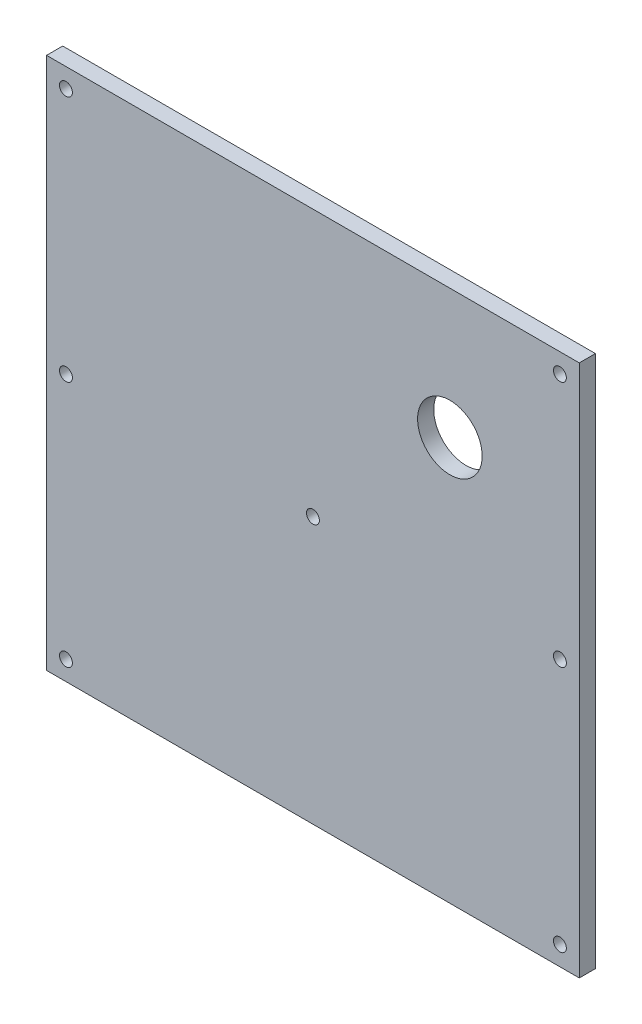
ISO-10303-21;
HEADER;
FILE_DESCRIPTION(('STEP AP214'),'2;1');
FILE_NAME('part.step','',(''),(''),'','','');
FILE_SCHEMA(('AUTOMOTIVE_DESIGN { 1 0 10303 214 1 1 1 1 }'));
ENDSEC;
DATA;
#1=APPLICATION_CONTEXT('core data for automotive mechanical design processes');
#2=APPLICATION_PROTOCOL_DEFINITION('international standard','automotive_design',2000,#1);
#3=PRODUCT_CONTEXT('',#1,'mechanical');
#4=PRODUCT('Part','Part','',(#3));
#5=PRODUCT_RELATED_PRODUCT_CATEGORY('part','',(#4));
#6=PRODUCT_DEFINITION_FORMATION('','',#4);
#7=PRODUCT_DEFINITION_CONTEXT('part definition',#1,'design');
#8=PRODUCT_DEFINITION('design','',#6,#7);
#9=PRODUCT_DEFINITION_SHAPE('','',#8);
#10=(LENGTH_UNIT() NAMED_UNIT(*) SI_UNIT(.MILLI.,.METRE.));
#11=(NAMED_UNIT(*) PLANE_ANGLE_UNIT() SI_UNIT($,.RADIAN.));
#12=(NAMED_UNIT(*) SI_UNIT($,.STERADIAN.) SOLID_ANGLE_UNIT());
#13=UNCERTAINTY_MEASURE_WITH_UNIT(LENGTH_MEASURE(1.E-05),#10,'distance_accuracy_value','');
#14=(GEOMETRIC_REPRESENTATION_CONTEXT(3) GLOBAL_UNCERTAINTY_ASSIGNED_CONTEXT((#13)) GLOBAL_UNIT_ASSIGNED_CONTEXT((#10,
#11,#12)) REPRESENTATION_CONTEXT('',''));
#15=CARTESIAN_POINT('',(0.,0.,0.));
#16=DIRECTION('',(0.,0.,1.));
#17=DIRECTION('',(1.,0.,0.));
#18=AXIS2_PLACEMENT_3D('',#15,#16,#17);
#19=CARTESIAN_POINT('',(0.,0.,0.));
#20=DIRECTION('',(0.,0.,-1.));
#21=DIRECTION('',(-1.,0.,0.));
#22=AXIS2_PLACEMENT_3D('',#19,#20,#21);
#23=PLANE('',#22);
#24=CARTESIAN_POINT('',(42.4168660797203,42.4434253709725,0.));
#25=DIRECTION('',(0.,0.,1.));
#26=DIRECTION('',(1.,0.,0.));
#27=AXIS2_PLACEMENT_3D('',#24,#25,#26);
#28=CIRCLE('',#27,10.);
#29=CARTESIAN_POINT('',(52.4168660797203,42.4434253709725,0.));
#30=VERTEX_POINT('',#29);
#31=EDGE_CURVE('E180',#30,#30,#28,.T.);
#32=ORIENTED_EDGE('',*,*,#31,.T.);
#33=EDGE_LOOP('',(#32));
#34=FACE_BOUND('',#33,.T.);
#35=CARTESIAN_POINT('',(76.5,76.5,0.));
#36=DIRECTION('',(0.,0.,1.));
#37=DIRECTION('',(1.,0.,0.));
#38=AXIS2_PLACEMENT_3D('',#35,#36,#37);
#39=CIRCLE('',#38,2.);
#40=CARTESIAN_POINT('',(78.5,76.5,0.));
#41=VERTEX_POINT('',#40);
#42=EDGE_CURVE('E195',#41,#41,#39,.T.);
#43=ORIENTED_EDGE('',*,*,#42,.T.);
#44=EDGE_LOOP('',(#43));
#45=FACE_BOUND('',#44,.T.);
#46=CARTESIAN_POINT('',(76.5,-76.5,0.));
#47=DIRECTION('',(0.,0.,1.));
#48=DIRECTION('',(1.,0.,0.));
#49=AXIS2_PLACEMENT_3D('',#46,#47,#48);
#50=CIRCLE('',#49,2.);
#51=CARTESIAN_POINT('',(78.5,-76.5,0.));
#52=VERTEX_POINT('',#51);
#53=EDGE_CURVE('E207',#52,#52,#50,.T.);
#54=ORIENTED_EDGE('',*,*,#53,.T.);
#55=EDGE_LOOP('',(#54));
#56=FACE_BOUND('',#55,.T.);
#57=CARTESIAN_POINT('',(-76.5,0.,0.));
#58=DIRECTION('',(0.,0.,1.));
#59=DIRECTION('',(1.,0.,0.));
#60=AXIS2_PLACEMENT_3D('',#57,#58,#59);
#61=CIRCLE('',#60,2.);
#62=CARTESIAN_POINT('',(-74.5,0.,0.));
#63=VERTEX_POINT('',#62);
#64=EDGE_CURVE('E219',#63,#63,#61,.T.);
#65=ORIENTED_EDGE('',*,*,#64,.T.);
#66=EDGE_LOOP('',(#65));
#67=FACE_BOUND('',#66,.T.);
#68=DIRECTION('',(0.,1.,0.));
#69=VECTOR('',#68,1.);
#70=CARTESIAN_POINT('',(82.5,-82.5,0.));
#71=LINE('',#70,#69);
#72=CARTESIAN_POINT('',(82.5,-82.5,0.));
#73=VERTEX_POINT('',#72);
#74=CARTESIAN_POINT('',(82.5,82.5,0.));
#75=VERTEX_POINT('',#74);
#76=EDGE_CURVE('E231',#73,#75,#71,.T.);
#77=ORIENTED_EDGE('',*,*,#76,.F.);
#78=DIRECTION('',(1.,0.,0.));
#79=VECTOR('',#78,1.);
#80=CARTESIAN_POINT('',(-82.5,-82.5,0.));
#81=LINE('',#80,#79);
#82=CARTESIAN_POINT('',(-82.5,-82.5,0.));
#83=VERTEX_POINT('',#82);
#84=EDGE_CURVE('E78',#83,#73,#81,.T.);
#85=ORIENTED_EDGE('',*,*,#84,.F.);
#86=DIRECTION('',(0.,-1.,0.));
#87=VECTOR('',#86,1.);
#88=CARTESIAN_POINT('',(-82.5,-82.5,0.));
#89=LINE('',#88,#87);
#90=CARTESIAN_POINT('',(-82.5,82.5,0.));
#91=VERTEX_POINT('',#90);
#92=EDGE_CURVE('E245',#91,#83,#89,.T.);
#93=ORIENTED_EDGE('',*,*,#92,.F.);
#94=DIRECTION('',(-1.,0.,0.));
#95=VECTOR('',#94,1.);
#96=CARTESIAN_POINT('',(-82.5,82.5,0.));
#97=LINE('',#96,#95);
#98=EDGE_CURVE('E243',#75,#91,#97,.T.);
#99=ORIENTED_EDGE('',*,*,#98,.F.);
#100=EDGE_LOOP('',(#77,#85,#93,#99));
#101=FACE_BOUND('',#100,.T.);
#102=CARTESIAN_POINT('',(-76.5,76.5,0.));
#103=DIRECTION('',(0.,0.,1.));
#104=DIRECTION('',(1.,0.,0.));
#105=AXIS2_PLACEMENT_3D('',#102,#103,#104);
#106=CIRCLE('',#105,2.);
#107=CARTESIAN_POINT('',(-74.5,76.5,0.));
#108=VERTEX_POINT('',#107);
#109=EDGE_CURVE('E225',#108,#108,#106,.T.);
#110=ORIENTED_EDGE('',*,*,#109,.T.);
#111=EDGE_LOOP('',(#110));
#112=FACE_BOUND('',#111,.T.);
#113=CARTESIAN_POINT('',(-76.5,-76.5,0.));
#114=DIRECTION('',(0.,0.,1.));
#115=DIRECTION('',(1.,0.,0.));
#116=AXIS2_PLACEMENT_3D('',#113,#114,#115);
#117=CIRCLE('',#116,2.00000000000004);
#118=CARTESIAN_POINT('',(-74.5,-76.5,0.));
#119=VERTEX_POINT('',#118);
#120=EDGE_CURVE('E213',#119,#119,#117,.T.);
#121=ORIENTED_EDGE('',*,*,#120,.T.);
#122=EDGE_LOOP('',(#121));
#123=FACE_BOUND('',#122,.T.);
#124=CARTESIAN_POINT('',(76.5,0.,0.));
#125=DIRECTION('',(0.,0.,1.));
#126=DIRECTION('',(1.,0.,0.));
#127=AXIS2_PLACEMENT_3D('',#124,#125,#126);
#128=CIRCLE('',#127,2.);
#129=CARTESIAN_POINT('',(78.5,0.,0.));
#130=VERTEX_POINT('',#129);
#131=EDGE_CURVE('E201',#130,#130,#128,.T.);
#132=ORIENTED_EDGE('',*,*,#131,.T.);
#133=EDGE_LOOP('',(#132));
#134=FACE_BOUND('',#133,.T.);
#135=CARTESIAN_POINT('',(0.,0.,0.));
#136=DIRECTION('',(0.,0.,1.));
#137=DIRECTION('',(1.,0.,0.));
#138=AXIS2_PLACEMENT_3D('',#135,#136,#137);
#139=CIRCLE('',#138,2.);
#140=CARTESIAN_POINT('',(2.00000000000001,0.,0.));
#141=VERTEX_POINT('',#140);
#142=EDGE_CURVE('E190',#141,#141,#139,.T.);
#143=ORIENTED_EDGE('',*,*,#142,.T.);
#144=EDGE_LOOP('',(#143));
#145=FACE_BOUND('',#144,.T.);
#146=DIRECTION('',(0.,1.,0.));
#147=VECTOR('',#146,1.);
#148=CARTESIAN_POINT('',(2.00000000000002,12.2284161474005,0.));
#149=LINE('',#148,#147);
#150=CARTESIAN_POINT('',(2.00000000000001,7.2284161474005,0.));
#151=VERTEX_POINT('',#150);
#152=CARTESIAN_POINT('',(2.00000000000002,12.2284161474005,0.));
#153=VERTEX_POINT('',#152);
#154=EDGE_CURVE('E525',#151,#153,#149,.T.);
#155=ORIENTED_EDGE('',*,*,#154,.F.);
#156=CARTESIAN_POINT('',(0.,0.,0.));
#157=DIRECTION('',(0.,0.,1.));
#158=DIRECTION('',(-1.,0.,0.));
#159=AXIS2_PLACEMENT_3D('',#156,#157,#158);
#160=CIRCLE('',#159,7.50000000000001);
#161=CARTESIAN_POINT('',(3.99999999999999,6.3442887702248,0.));
#162=VERTEX_POINT('',#161);
#163=EDGE_CURVE('E178',#162,#151,#160,.T.);
#164=ORIENTED_EDGE('',*,*,#163,.F.);
#165=DIRECTION('',(0.,-1.,0.));
#166=VECTOR('',#165,1.);
#167=CARTESIAN_POINT('',(4.00000000000001,77.1438713867357,0.));
#168=LINE('',#167,#166);
#169=CARTESIAN_POINT('',(4.00000000000001,77.1438713867357,0.));
#170=VERTEX_POINT('',#169);
#171=EDGE_CURVE('E174',#170,#162,#168,.T.);
#172=ORIENTED_EDGE('',*,*,#171,.F.);
#173=DIRECTION('',(1.,0.,0.));
#174=VECTOR('',#173,1.);
#175=CARTESIAN_POINT('',(2.00000000000001,77.1438713867357,0.));
#176=LINE('',#175,#174);
#177=CARTESIAN_POINT('',(2.00000000000001,77.1438713867357,0.));
#178=VERTEX_POINT('',#177);
#179=EDGE_CURVE('E521',#178,#170,#176,.T.);
#180=ORIENTED_EDGE('',*,*,#179,.F.);
#181=DIRECTION('',(0.,1.,0.));
#182=VECTOR('',#181,1.);
#183=CARTESIAN_POINT('',(2.00000000000001,77.1438713867357,0.));
#184=LINE('',#183,#182);
#185=CARTESIAN_POINT('',(2.00000000000001,72.5000000000001,0.));
#186=VERTEX_POINT('',#185);
#187=EDGE_CURVE('E545',#186,#178,#184,.T.);
#188=ORIENTED_EDGE('',*,*,#187,.F.);
#189=DIRECTION('',(1.,0.,0.));
#190=VECTOR('',#189,1.);
#191=CARTESIAN_POINT('',(-2.,72.5,0.));
#192=LINE('',#191,#190);
#193=CARTESIAN_POINT('',(-2.,72.5,0.));
#194=VERTEX_POINT('',#193);
#195=EDGE_CURVE('E543',#194,#186,#192,.T.);
#196=ORIENTED_EDGE('',*,*,#195,.F.);
#197=DIRECTION('',(0.,-1.,0.));
#198=VECTOR('',#197,1.);
#199=CARTESIAN_POINT('',(-1.99999999999998,77.4913592979423,0.));
#200=LINE('',#199,#198);
#201=CARTESIAN_POINT('',(-1.99999999999998,77.4913592979423,0.));
#202=VERTEX_POINT('',#201);
#203=EDGE_CURVE('E541',#202,#194,#200,.T.);
#204=ORIENTED_EDGE('',*,*,#203,.F.);
#205=DIRECTION('',(0.999990667414141,-0.00432031070884864,0.));
#206=VECTOR('',#205,1.);
#207=CARTESIAN_POINT('',(-3.99999999999998,77.5,0.));
#208=LINE('',#207,#206);
#209=CARTESIAN_POINT('',(-3.99999999999998,77.5,0.));
#210=VERTEX_POINT('',#209);
#211=EDGE_CURVE('E539',#210,#202,#208,.T.);
#212=ORIENTED_EDGE('',*,*,#211,.F.);
#213=DIRECTION('',(0.,1.,0.));
#214=VECTOR('',#213,1.);
#215=CARTESIAN_POINT('',(-3.99999999999998,77.5,0.));
#216=LINE('',#215,#214);
#217=CARTESIAN_POINT('',(-4.00000000000001,6.34428877022478,0.));
#218=VERTEX_POINT('',#217);
#219=EDGE_CURVE('E537',#218,#210,#216,.T.);
#220=ORIENTED_EDGE('',*,*,#219,.F.);
#221=CARTESIAN_POINT('',(0.,0.,0.));
#222=DIRECTION('',(0.,0.,1.));
#223=DIRECTION('',(-1.,0.,0.));
#224=AXIS2_PLACEMENT_3D('',#221,#222,#223);
#225=CIRCLE('',#224,7.50000000000001);
#226=CARTESIAN_POINT('',(-1.99999999999998,7.22841614740051,0.));
#227=VERTEX_POINT('',#226);
#228=EDGE_CURVE('E535',#227,#218,#225,.T.);
#229=ORIENTED_EDGE('',*,*,#228,.F.);
#230=DIRECTION('',(0.,-1.,0.));
#231=VECTOR('',#230,1.);
#232=CARTESIAN_POINT('',(-1.99999999999999,12.2284161474005,0.));
#233=LINE('',#232,#231);
#234=CARTESIAN_POINT('',(-1.99999999999999,12.2284161474005,0.));
#235=VERTEX_POINT('',#234);
#236=EDGE_CURVE('E533',#235,#227,#233,.T.);
#237=ORIENTED_EDGE('',*,*,#236,.F.);
#238=DIRECTION('',(-1.,0.,0.));
#239=VECTOR('',#238,1.);
#240=CARTESIAN_POINT('',(-1.99999999999999,12.2284161474005,0.));
#241=LINE('',#240,#239);
#242=EDGE_CURVE('E527',#153,#235,#241,.T.);
#243=ORIENTED_EDGE('',*,*,#242,.F.);
#244=EDGE_LOOP('',(#155,#164,#172,#180,#188,#196,#204,#212,#220,#229,#237,#243));
#245=FACE_BOUND('',#244,.T.);
#246=ADVANCED_FACE('F33',(#34,#45,#56,#67,#101,#112,#123,#134,#145,#245),#23,.T.);
#247=CARTESIAN_POINT('',(0.,0.,5.));
#248=DIRECTION('',(0.,0.,-1.));
#249=DIRECTION('',(-1.,0.,0.));
#250=AXIS2_PLACEMENT_3D('',#247,#248,#249);
#251=PLANE('',#250);
#252=CARTESIAN_POINT('',(0.,0.,5.));
#253=DIRECTION('',(0.,0.,1.));
#254=DIRECTION('',(1.,0.,0.));
#255=AXIS2_PLACEMENT_3D('',#252,#253,#254);
#256=CIRCLE('',#255,2.);
#257=CARTESIAN_POINT('',(2.00000000000001,0.,5.));
#258=VERTEX_POINT('',#257);
#259=EDGE_CURVE('E192',#258,#258,#256,.T.);
#260=ORIENTED_EDGE('',*,*,#259,.F.);
#261=EDGE_LOOP('',(#260));
#262=FACE_BOUND('',#261,.T.);
#263=CARTESIAN_POINT('',(76.5,0.,5.));
#264=DIRECTION('',(0.,0.,1.));
#265=DIRECTION('',(1.,0.,0.));
#266=AXIS2_PLACEMENT_3D('',#263,#264,#265);
#267=CIRCLE('',#266,2.);
#268=CARTESIAN_POINT('',(78.5,0.,5.));
#269=VERTEX_POINT('',#268);
#270=EDGE_CURVE('E204',#269,#269,#267,.T.);
#271=ORIENTED_EDGE('',*,*,#270,.F.);
#272=EDGE_LOOP('',(#271));
#273=FACE_BOUND('',#272,.T.);
#274=CARTESIAN_POINT('',(-76.5,-76.5,5.));
#275=DIRECTION('',(0.,0.,1.));
#276=DIRECTION('',(1.,0.,0.));
#277=AXIS2_PLACEMENT_3D('',#274,#275,#276);
#278=CIRCLE('',#277,2.00000000000004);
#279=CARTESIAN_POINT('',(-74.5,-76.5,5.));
#280=VERTEX_POINT('',#279);
#281=EDGE_CURVE('E216',#280,#280,#278,.T.);
#282=ORIENTED_EDGE('',*,*,#281,.F.);
#283=EDGE_LOOP('',(#282));
#284=FACE_BOUND('',#283,.T.);
#285=CARTESIAN_POINT('',(-76.5,76.5,5.));
#286=DIRECTION('',(0.,0.,1.));
#287=DIRECTION('',(1.,0.,0.));
#288=AXIS2_PLACEMENT_3D('',#285,#286,#287);
#289=CIRCLE('',#288,2.);
#290=CARTESIAN_POINT('',(-74.5,76.5,5.));
#291=VERTEX_POINT('',#290);
#292=EDGE_CURVE('E228',#291,#291,#289,.T.);
#293=ORIENTED_EDGE('',*,*,#292,.F.);
#294=EDGE_LOOP('',(#293));
#295=FACE_BOUND('',#294,.T.);
#296=DIRECTION('',(0.,1.,0.));
#297=VECTOR('',#296,1.);
#298=CARTESIAN_POINT('',(82.5,-82.5,5.));
#299=LINE('',#298,#297);
#300=CARTESIAN_POINT('',(82.5,-82.5,5.));
#301=VERTEX_POINT('',#300);
#302=CARTESIAN_POINT('',(82.5,82.5,5.));
#303=VERTEX_POINT('',#302);
#304=EDGE_CURVE('E234',#301,#303,#299,.T.);
#305=ORIENTED_EDGE('',*,*,#304,.T.);
#306=DIRECTION('',(-1.,0.,0.));
#307=VECTOR('',#306,1.);
#308=CARTESIAN_POINT('',(-82.5,82.5,5.));
#309=LINE('',#308,#307);
#310=CARTESIAN_POINT('',(-82.5,82.5,5.));
#311=VERTEX_POINT('',#310);
#312=EDGE_CURVE('E85',#303,#311,#309,.T.);
#313=ORIENTED_EDGE('',*,*,#312,.T.);
#314=DIRECTION('',(0.,-1.,0.));
#315=VECTOR('',#314,1.);
#316=CARTESIAN_POINT('',(-82.5,-82.5,5.));
#317=LINE('',#316,#315);
#318=CARTESIAN_POINT('',(-82.5,-82.5,5.));
#319=VERTEX_POINT('',#318);
#320=EDGE_CURVE('E237',#311,#319,#317,.T.);
#321=ORIENTED_EDGE('',*,*,#320,.T.);
#322=DIRECTION('',(1.,0.,0.));
#323=VECTOR('',#322,1.);
#324=CARTESIAN_POINT('',(-82.5,-82.5,5.));
#325=LINE('',#324,#323);
#326=EDGE_CURVE('E57',#319,#301,#325,.T.);
#327=ORIENTED_EDGE('',*,*,#326,.T.);
#328=EDGE_LOOP('',(#305,#313,#321,#327));
#329=FACE_BOUND('',#328,.T.);
#330=CARTESIAN_POINT('',(-76.5,0.,5.));
#331=DIRECTION('',(0.,0.,1.));
#332=DIRECTION('',(1.,0.,0.));
#333=AXIS2_PLACEMENT_3D('',#330,#331,#332);
#334=CIRCLE('',#333,2.);
#335=CARTESIAN_POINT('',(-74.5,0.,5.));
#336=VERTEX_POINT('',#335);
#337=EDGE_CURVE('E222',#336,#336,#334,.T.);
#338=ORIENTED_EDGE('',*,*,#337,.F.);
#339=EDGE_LOOP('',(#338));
#340=FACE_BOUND('',#339,.T.);
#341=CARTESIAN_POINT('',(76.5,-76.5,5.));
#342=DIRECTION('',(0.,0.,1.));
#343=DIRECTION('',(1.,0.,0.));
#344=AXIS2_PLACEMENT_3D('',#341,#342,#343);
#345=CIRCLE('',#344,2.);
#346=CARTESIAN_POINT('',(78.5,-76.5,5.));
#347=VERTEX_POINT('',#346);
#348=EDGE_CURVE('E210',#347,#347,#345,.T.);
#349=ORIENTED_EDGE('',*,*,#348,.F.);
#350=EDGE_LOOP('',(#349));
#351=FACE_BOUND('',#350,.T.);
#352=CARTESIAN_POINT('',(76.5,76.5,5.));
#353=DIRECTION('',(0.,0.,1.));
#354=DIRECTION('',(1.,0.,0.));
#355=AXIS2_PLACEMENT_3D('',#352,#353,#354);
#356=CIRCLE('',#355,2.);
#357=CARTESIAN_POINT('',(78.5,76.5,5.));
#358=VERTEX_POINT('',#357);
#359=EDGE_CURVE('E198',#358,#358,#356,.T.);
#360=ORIENTED_EDGE('',*,*,#359,.F.);
#361=EDGE_LOOP('',(#360));
#362=FACE_BOUND('',#361,.T.);
#363=CARTESIAN_POINT('',(42.4168660797203,42.4434253709725,5.));
#364=DIRECTION('',(0.,0.,1.));
#365=DIRECTION('',(1.,0.,0.));
#366=AXIS2_PLACEMENT_3D('',#363,#364,#365);
#367=CIRCLE('',#366,10.);
#368=CARTESIAN_POINT('',(52.4168660797203,42.4434253709725,5.));
#369=VERTEX_POINT('',#368);
#370=EDGE_CURVE('E183',#369,#369,#367,.T.);
#371=ORIENTED_EDGE('',*,*,#370,.F.);
#372=EDGE_LOOP('',(#371));
#373=FACE_BOUND('',#372,.T.);
#374=ADVANCED_FACE('F277',(#262,#273,#284,#295,#329,#340,#351,#362,#373),#251,.F.);
#375=CARTESIAN_POINT('',(82.5,-82.5,5.));
#376=DIRECTION('',(-1.,0.,0.));
#377=DIRECTION('',(0.,0.,1.));
#378=AXIS2_PLACEMENT_3D('',#375,#376,#377);
#379=PLANE('',#378);
#380=ORIENTED_EDGE('',*,*,#76,.T.);
#381=DIRECTION('',(0.,0.,-1.));
#382=VECTOR('',#381,1.);
#383=CARTESIAN_POINT('',(82.5,82.5,5.));
#384=LINE('',#383,#382);
#385=EDGE_CURVE('E11',#303,#75,#384,.T.);
#386=ORIENTED_EDGE('',*,*,#385,.F.);
#387=ORIENTED_EDGE('',*,*,#304,.F.);
#388=DIRECTION('',(0.,0.,-1.));
#389=VECTOR('',#388,1.);
#390=CARTESIAN_POINT('',(82.5,-82.5,5.));
#391=LINE('',#390,#389);
#392=EDGE_CURVE('E240',#301,#73,#391,.T.);
#393=ORIENTED_EDGE('',*,*,#392,.T.);
#394=EDGE_LOOP('',(#380,#386,#387,#393));
#395=FACE_BOUND('',#394,.T.);
#396=ADVANCED_FACE('F35',(#395),#379,.F.);
#397=CARTESIAN_POINT('',(-82.5,82.5,5.));
#398=DIRECTION('',(0.,-1.,0.));
#399=DIRECTION('',(0.,0.,-1.));
#400=AXIS2_PLACEMENT_3D('',#397,#398,#399);
#401=PLANE('',#400);
#402=ORIENTED_EDGE('',*,*,#98,.T.);
#403=DIRECTION('',(0.,0.,-1.));
#404=VECTOR('',#403,1.);
#405=CARTESIAN_POINT('',(-82.5,82.5,5.));
#406=LINE('',#405,#404);
#407=EDGE_CURVE('E41',#311,#91,#406,.T.);
#408=ORIENTED_EDGE('',*,*,#407,.F.);
#409=ORIENTED_EDGE('',*,*,#312,.F.);
#410=ORIENTED_EDGE('',*,*,#385,.T.);
#411=EDGE_LOOP('',(#402,#408,#409,#410));
#412=FACE_BOUND('',#411,.T.);
#413=ADVANCED_FACE('F273',(#412),#401,.F.);
#414=CARTESIAN_POINT('',(-82.5,-82.5,5.));
#415=DIRECTION('',(1.,0.,0.));
#416=DIRECTION('',(0.,0.,-1.));
#417=AXIS2_PLACEMENT_3D('',#414,#415,#416);
#418=PLANE('',#417);
#419=ORIENTED_EDGE('',*,*,#92,.T.);
#420=DIRECTION('',(0.,0.,-1.));
#421=VECTOR('',#420,1.);
#422=CARTESIAN_POINT('',(-82.5,-82.5,5.));
#423=LINE('',#422,#421);
#424=EDGE_CURVE('E249',#319,#83,#423,.T.);
#425=ORIENTED_EDGE('',*,*,#424,.F.);
#426=ORIENTED_EDGE('',*,*,#320,.F.);
#427=ORIENTED_EDGE('',*,*,#407,.T.);
#428=EDGE_LOOP('',(#419,#425,#426,#427));
#429=FACE_BOUND('',#428,.T.);
#430=ADVANCED_FACE('F254',(#429),#418,.F.);
#431=CARTESIAN_POINT('',(-82.5,-82.5,5.));
#432=DIRECTION('',(0.,1.,0.));
#433=DIRECTION('',(0.,0.,1.));
#434=AXIS2_PLACEMENT_3D('',#431,#432,#433);
#435=PLANE('',#434);
#436=ORIENTED_EDGE('',*,*,#84,.T.);
#437=ORIENTED_EDGE('',*,*,#392,.F.);
#438=ORIENTED_EDGE('',*,*,#326,.F.);
#439=ORIENTED_EDGE('',*,*,#424,.T.);
#440=EDGE_LOOP('',(#436,#437,#438,#439));
#441=FACE_BOUND('',#440,.T.);
#442=ADVANCED_FACE('F262',(#441),#435,.F.);
#443=CARTESIAN_POINT('',(-76.5,76.5,5.));
#444=DIRECTION('',(0.,0.,-1.));
#445=DIRECTION('',(-1.,0.,0.));
#446=AXIS2_PLACEMENT_3D('',#443,#444,#445);
#447=CYLINDRICAL_SURFACE('',#446,2.);
#448=ORIENTED_EDGE('',*,*,#292,.T.);
#449=EDGE_LOOP('',(#448));
#450=FACE_BOUND('',#449,.T.);
#451=ORIENTED_EDGE('',*,*,#109,.F.);
#452=EDGE_LOOP('',(#451));
#453=FACE_BOUND('',#452,.T.);
#454=ADVANCED_FACE('F264',(#450,#453),#447,.F.);
#455=CARTESIAN_POINT('',(-76.5,0.,5.));
#456=DIRECTION('',(0.,0.,-1.));
#457=DIRECTION('',(-1.,0.,0.));
#458=AXIS2_PLACEMENT_3D('',#455,#456,#457);
#459=CYLINDRICAL_SURFACE('',#458,2.);
#460=ORIENTED_EDGE('',*,*,#337,.T.);
#461=EDGE_LOOP('',(#460));
#462=FACE_BOUND('',#461,.T.);
#463=ORIENTED_EDGE('',*,*,#64,.F.);
#464=EDGE_LOOP('',(#463));
#465=FACE_BOUND('',#464,.T.);
#466=ADVANCED_FACE('F270',(#462,#465),#459,.F.);
#467=CARTESIAN_POINT('',(-76.5,-76.5,5.));
#468=DIRECTION('',(0.,0.,-1.));
#469=DIRECTION('',(-1.,0.,0.));
#470=AXIS2_PLACEMENT_3D('',#467,#468,#469);
#471=CYLINDRICAL_SURFACE('',#470,2.00000000000004);
#472=ORIENTED_EDGE('',*,*,#281,.T.);
#473=EDGE_LOOP('',(#472));
#474=FACE_BOUND('',#473,.T.);
#475=ORIENTED_EDGE('',*,*,#120,.F.);
#476=EDGE_LOOP('',(#475));
#477=FACE_BOUND('',#476,.T.);
#478=ADVANCED_FACE('F290',(#474,#477),#471,.F.);
#479=CARTESIAN_POINT('',(76.5,-76.5,5.));
#480=DIRECTION('',(0.,0.,-1.));
#481=DIRECTION('',(-1.,0.,0.));
#482=AXIS2_PLACEMENT_3D('',#479,#480,#481);
#483=CYLINDRICAL_SURFACE('',#482,2.);
#484=ORIENTED_EDGE('',*,*,#348,.T.);
#485=EDGE_LOOP('',(#484));
#486=FACE_BOUND('',#485,.T.);
#487=ORIENTED_EDGE('',*,*,#53,.F.);
#488=EDGE_LOOP('',(#487));
#489=FACE_BOUND('',#488,.T.);
#490=ADVANCED_FACE('F294',(#486,#489),#483,.F.);
#491=CARTESIAN_POINT('',(76.5,0.,5.));
#492=DIRECTION('',(0.,0.,-1.));
#493=DIRECTION('',(-1.,0.,0.));
#494=AXIS2_PLACEMENT_3D('',#491,#492,#493);
#495=CYLINDRICAL_SURFACE('',#494,2.);
#496=ORIENTED_EDGE('',*,*,#270,.T.);
#497=EDGE_LOOP('',(#496));
#498=FACE_BOUND('',#497,.T.);
#499=ORIENTED_EDGE('',*,*,#131,.F.);
#500=EDGE_LOOP('',(#499));
#501=FACE_BOUND('',#500,.T.);
#502=ADVANCED_FACE('F298',(#498,#501),#495,.F.);
#503=CARTESIAN_POINT('',(76.5,76.5,5.));
#504=DIRECTION('',(0.,0.,-1.));
#505=DIRECTION('',(-1.,0.,0.));
#506=AXIS2_PLACEMENT_3D('',#503,#504,#505);
#507=CYLINDRICAL_SURFACE('',#506,2.);
#508=ORIENTED_EDGE('',*,*,#359,.T.);
#509=EDGE_LOOP('',(#508));
#510=FACE_BOUND('',#509,.T.);
#511=ORIENTED_EDGE('',*,*,#42,.F.);
#512=EDGE_LOOP('',(#511));
#513=FACE_BOUND('',#512,.T.);
#514=ADVANCED_FACE('F302',(#510,#513),#507,.F.);
#515=CARTESIAN_POINT('',(0.,0.,5.));
#516=DIRECTION('',(0.,0.,-1.));
#517=DIRECTION('',(-1.,0.,0.));
#518=AXIS2_PLACEMENT_3D('',#515,#516,#517);
#519=CYLINDRICAL_SURFACE('',#518,2.);
#520=ORIENTED_EDGE('',*,*,#259,.T.);
#521=EDGE_LOOP('',(#520));
#522=FACE_BOUND('',#521,.T.);
#523=ORIENTED_EDGE('',*,*,#142,.F.);
#524=EDGE_LOOP('',(#523));
#525=FACE_BOUND('',#524,.T.);
#526=ADVANCED_FACE('F306',(#522,#525),#519,.F.);
#527=CARTESIAN_POINT('',(42.4168660797203,42.4434253709725,5.));
#528=DIRECTION('',(0.,0.,-1.));
#529=DIRECTION('',(-1.,0.,0.));
#530=AXIS2_PLACEMENT_3D('',#527,#528,#529);
#531=CYLINDRICAL_SURFACE('',#530,10.);
#532=ORIENTED_EDGE('',*,*,#370,.T.);
#533=EDGE_LOOP('',(#532));
#534=FACE_BOUND('',#533,.T.);
#535=ORIENTED_EDGE('',*,*,#31,.F.);
#536=EDGE_LOOP('',(#535));
#537=FACE_BOUND('',#536,.T.);
#538=ADVANCED_FACE('F310',(#534,#537),#531,.F.);
#539=CARTESIAN_POINT('',(0.,0.,-5.));
#540=DIRECTION('',(0.,0.,1.));
#541=DIRECTION('',(1.,0.,0.));
#542=AXIS2_PLACEMENT_3D('',#539,#540,#541);
#543=CYLINDRICAL_SURFACE('',#542,7.50000000000001);
#544=ORIENTED_EDGE('',*,*,#163,.T.);
#545=DIRECTION('',(0.,0.,1.));
#546=VECTOR('',#545,1.);
#547=CARTESIAN_POINT('',(2.00000000000001,7.2284161474005,-5.));
#548=LINE('',#547,#546);
#549=CARTESIAN_POINT('',(2.00000000000001,7.2284161474005,-5.));
#550=VERTEX_POINT('',#549);
#551=EDGE_CURVE('E159',#550,#151,#548,.T.);
#552=ORIENTED_EDGE('',*,*,#551,.F.);
#553=CARTESIAN_POINT('',(0.,0.,-5.));
#554=DIRECTION('',(0.,0.,1.));
#555=DIRECTION('',(-1.,0.,0.));
#556=AXIS2_PLACEMENT_3D('',#553,#554,#555);
#557=CIRCLE('',#556,7.50000000000001);
#558=CARTESIAN_POINT('',(3.99999999999999,6.3442887702248,-5.));
#559=VERTEX_POINT('',#558);
#560=EDGE_CURVE('E166',#559,#550,#557,.T.);
#561=ORIENTED_EDGE('',*,*,#560,.F.);
#562=DIRECTION('',(0.,0.,1.));
#563=VECTOR('',#562,1.);
#564=CARTESIAN_POINT('',(3.99999999999999,6.3442887702248,-5.));
#565=LINE('',#564,#563);
#566=EDGE_CURVE('E518',#559,#162,#565,.T.);
#567=ORIENTED_EDGE('',*,*,#566,.T.);
#568=EDGE_LOOP('',(#544,#552,#561,#567));
#569=FACE_BOUND('',#568,.T.);
#570=ADVANCED_FACE('F176',(#569),#543,.F.);
#571=CARTESIAN_POINT('',(2.00000000000002,12.2284161474005,-5.));
#572=DIRECTION('',(1.,0.,0.));
#573=DIRECTION('',(0.,1.,0.));
#574=AXIS2_PLACEMENT_3D('',#571,#572,#573);
#575=PLANE('',#574);
#576=ORIENTED_EDGE('',*,*,#154,.T.);
#577=DIRECTION('',(0.,0.,1.));
#578=VECTOR('',#577,1.);
#579=CARTESIAN_POINT('',(2.00000000000002,12.2284161474005,-5.));
#580=LINE('',#579,#578);
#581=CARTESIAN_POINT('',(2.00000000000002,12.2284161474005,-5.));
#582=VERTEX_POINT('',#581);
#583=EDGE_CURVE('E162',#582,#153,#580,.T.);
#584=ORIENTED_EDGE('',*,*,#583,.F.);
#585=DIRECTION('',(0.,1.,0.));
#586=VECTOR('',#585,1.);
#587=CARTESIAN_POINT('',(2.00000000000002,12.2284161474005,-5.));
#588=LINE('',#587,#586);
#589=EDGE_CURVE('E155',#550,#582,#588,.T.);
#590=ORIENTED_EDGE('',*,*,#589,.F.);
#591=ORIENTED_EDGE('',*,*,#551,.T.);
#592=EDGE_LOOP('',(#576,#584,#590,#591));
#593=FACE_BOUND('',#592,.T.);
#594=ADVANCED_FACE('F157',(#593),#575,.F.);
#595=CARTESIAN_POINT('',(-1.99999999999999,12.2284161474005,-5.));
#596=DIRECTION('',(0.,1.,0.));
#597=DIRECTION('',(0.,0.,1.));
#598=AXIS2_PLACEMENT_3D('',#595,#596,#597);
#599=PLANE('',#598);
#600=ORIENTED_EDGE('',*,*,#242,.T.);
#601=DIRECTION('',(0.,0.,1.));
#602=VECTOR('',#601,1.);
#603=CARTESIAN_POINT('',(-1.99999999999999,12.2284161474005,-5.));
#604=LINE('',#603,#602);
#605=CARTESIAN_POINT('',(-1.99999999999999,12.2284161474005,-5.));
#606=VERTEX_POINT('',#605);
#607=EDGE_CURVE('E185',#606,#235,#604,.T.);
#608=ORIENTED_EDGE('',*,*,#607,.F.);
#609=DIRECTION('',(-1.,0.,0.));
#610=VECTOR('',#609,1.);
#611=CARTESIAN_POINT('',(-1.99999999999999,12.2284161474005,-5.));
#612=LINE('',#611,#610);
#613=EDGE_CURVE('E165',#582,#606,#612,.T.);
#614=ORIENTED_EDGE('',*,*,#613,.F.);
#615=ORIENTED_EDGE('',*,*,#583,.T.);
#616=EDGE_LOOP('',(#600,#608,#614,#615));
#617=FACE_BOUND('',#616,.T.);
#618=ADVANCED_FACE('F319',(#617),#599,.F.);
#619=CARTESIAN_POINT('',(-1.99999999999999,12.2284161474005,-5.));
#620=DIRECTION('',(-1.,0.,0.));
#621=DIRECTION('',(0.,-1.,0.));
#622=AXIS2_PLACEMENT_3D('',#619,#620,#621);
#623=PLANE('',#622);
#624=ORIENTED_EDGE('',*,*,#236,.T.);
#625=DIRECTION('',(0.,0.,1.));
#626=VECTOR('',#625,1.);
#627=CARTESIAN_POINT('',(-1.99999999999998,7.22841614740051,-5.));
#628=LINE('',#627,#626);
#629=CARTESIAN_POINT('',(-1.99999999999998,7.22841614740051,-5.));
#630=VERTEX_POINT('',#629);
#631=EDGE_CURVE('E567',#630,#227,#628,.T.);
#632=ORIENTED_EDGE('',*,*,#631,.F.);
#633=DIRECTION('',(0.,-1.,0.));
#634=VECTOR('',#633,1.);
#635=CARTESIAN_POINT('',(-1.99999999999999,12.2284161474005,-5.));
#636=LINE('',#635,#634);
#637=EDGE_CURVE('E574',#606,#630,#636,.T.);
#638=ORIENTED_EDGE('',*,*,#637,.F.);
#639=ORIENTED_EDGE('',*,*,#607,.T.);
#640=EDGE_LOOP('',(#624,#632,#638,#639));
#641=FACE_BOUND('',#640,.T.);
#642=ADVANCED_FACE('F322',(#641),#623,.F.);
#643=CARTESIAN_POINT('',(0.,0.,-5.));
#644=DIRECTION('',(0.,0.,1.));
#645=DIRECTION('',(1.,0.,0.));
#646=AXIS2_PLACEMENT_3D('',#643,#644,#645);
#647=CYLINDRICAL_SURFACE('',#646,7.50000000000001);
#648=ORIENTED_EDGE('',*,*,#228,.T.);
#649=DIRECTION('',(0.,0.,1.));
#650=VECTOR('',#649,1.);
#651=CARTESIAN_POINT('',(-4.00000000000001,6.34428877022478,-5.));
#652=LINE('',#651,#650);
#653=CARTESIAN_POINT('',(-4.00000000000001,6.34428877022478,-5.));
#654=VERTEX_POINT('',#653);
#655=EDGE_CURVE('E564',#654,#218,#652,.T.);
#656=ORIENTED_EDGE('',*,*,#655,.F.);
#657=CARTESIAN_POINT('',(0.,0.,-5.));
#658=DIRECTION('',(0.,0.,1.));
#659=DIRECTION('',(-1.,0.,0.));
#660=AXIS2_PLACEMENT_3D('',#657,#658,#659);
#661=CIRCLE('',#660,7.50000000000001);
#662=EDGE_CURVE('E585',#630,#654,#661,.T.);
#663=ORIENTED_EDGE('',*,*,#662,.F.);
#664=ORIENTED_EDGE('',*,*,#631,.T.);
#665=EDGE_LOOP('',(#648,#656,#663,#664));
#666=FACE_BOUND('',#665,.T.);
#667=ADVANCED_FACE('F326',(#666),#647,.F.);
#668=CARTESIAN_POINT('',(-3.99999999999998,77.5,-5.));
#669=DIRECTION('',(1.,0.,0.));
#670=DIRECTION('',(0.,1.,0.));
#671=AXIS2_PLACEMENT_3D('',#668,#669,#670);
#672=PLANE('',#671);
#673=ORIENTED_EDGE('',*,*,#219,.T.);
#674=DIRECTION('',(0.,0.,1.));
#675=VECTOR('',#674,1.);
#676=CARTESIAN_POINT('',(-3.99999999999998,77.5,-5.));
#677=LINE('',#676,#675);
#678=CARTESIAN_POINT('',(-3.99999999999998,77.5,-5.));
#679=VERTEX_POINT('',#678);
#680=EDGE_CURVE('E561',#679,#210,#677,.T.);
#681=ORIENTED_EDGE('',*,*,#680,.F.);
#682=DIRECTION('',(0.,1.,0.));
#683=VECTOR('',#682,1.);
#684=CARTESIAN_POINT('',(-3.99999999999998,77.5,-5.));
#685=LINE('',#684,#683);
#686=EDGE_CURVE('E582',#654,#679,#685,.T.);
#687=ORIENTED_EDGE('',*,*,#686,.F.);
#688=ORIENTED_EDGE('',*,*,#655,.T.);
#689=EDGE_LOOP('',(#673,#681,#687,#688));
#690=FACE_BOUND('',#689,.T.);
#691=ADVANCED_FACE('F330',(#690),#672,.F.);
#692=CARTESIAN_POINT('',(-3.99999999999998,77.5,-5.));
#693=DIRECTION('',(-0.00432031070884864,-0.999990667414141,0.));
#694=DIRECTION('',(0.999990667414141,-0.00432031070884864,0.));
#695=AXIS2_PLACEMENT_3D('',#692,#693,#694);
#696=PLANE('',#695);
#697=ORIENTED_EDGE('',*,*,#211,.T.);
#698=DIRECTION('',(0.,0.,1.));
#699=VECTOR('',#698,1.);
#700=CARTESIAN_POINT('',(-1.99999999999998,77.4913592979423,-5.));
#701=LINE('',#700,#699);
#702=CARTESIAN_POINT('',(-1.99999999999998,77.4913592979423,-5.));
#703=VERTEX_POINT('',#702);
#704=EDGE_CURVE('E558',#703,#202,#701,.T.);
#705=ORIENTED_EDGE('',*,*,#704,.F.);
#706=DIRECTION('',(0.999990667414141,-0.00432031070884864,0.));
#707=VECTOR('',#706,1.);
#708=CARTESIAN_POINT('',(-3.99999999999998,77.5,-5.));
#709=LINE('',#708,#707);
#710=EDGE_CURVE('E584',#679,#703,#709,.T.);
#711=ORIENTED_EDGE('',*,*,#710,.F.);
#712=ORIENTED_EDGE('',*,*,#680,.T.);
#713=EDGE_LOOP('',(#697,#705,#711,#712));
#714=FACE_BOUND('',#713,.T.);
#715=ADVANCED_FACE('F334',(#714),#696,.F.);
#716=CARTESIAN_POINT('',(-1.99999999999998,77.4913592979423,-5.));
#717=DIRECTION('',(-1.,0.,0.));
#718=DIRECTION('',(0.,-1.,0.));
#719=AXIS2_PLACEMENT_3D('',#716,#717,#718);
#720=PLANE('',#719);
#721=ORIENTED_EDGE('',*,*,#203,.T.);
#722=DIRECTION('',(0.,0.,1.));
#723=VECTOR('',#722,1.);
#724=CARTESIAN_POINT('',(-2.,72.5,-5.));
#725=LINE('',#724,#723);
#726=CARTESIAN_POINT('',(-2.,72.5,-5.));
#727=VERTEX_POINT('',#726);
#728=EDGE_CURVE('E555',#727,#194,#725,.T.);
#729=ORIENTED_EDGE('',*,*,#728,.F.);
#730=DIRECTION('',(0.,-1.,0.));
#731=VECTOR('',#730,1.);
#732=CARTESIAN_POINT('',(-1.99999999999998,77.4913592979423,-5.));
#733=LINE('',#732,#731);
#734=EDGE_CURVE('E587',#703,#727,#733,.T.);
#735=ORIENTED_EDGE('',*,*,#734,.F.);
#736=ORIENTED_EDGE('',*,*,#704,.T.);
#737=EDGE_LOOP('',(#721,#729,#735,#736));
#738=FACE_BOUND('',#737,.T.);
#739=ADVANCED_FACE('F338',(#738),#720,.F.);
#740=CARTESIAN_POINT('',(-2.,72.5,-5.));
#741=DIRECTION('',(0.,-1.,0.));
#742=DIRECTION('',(1.,0.,0.));
#743=AXIS2_PLACEMENT_3D('',#740,#741,#742);
#744=PLANE('',#743);
#745=ORIENTED_EDGE('',*,*,#195,.T.);
#746=DIRECTION('',(0.,0.,1.));
#747=VECTOR('',#746,1.);
#748=CARTESIAN_POINT('',(2.00000000000001,72.5000000000001,-5.));
#749=LINE('',#748,#747);
#750=CARTESIAN_POINT('',(2.00000000000001,72.5000000000001,-5.));
#751=VERTEX_POINT('',#750);
#752=EDGE_CURVE('E552',#751,#186,#749,.T.);
#753=ORIENTED_EDGE('',*,*,#752,.F.);
#754=DIRECTION('',(1.,0.,0.));
#755=VECTOR('',#754,1.);
#756=CARTESIAN_POINT('',(-2.,72.5,-5.));
#757=LINE('',#756,#755);
#758=EDGE_CURVE('E593',#727,#751,#757,.T.);
#759=ORIENTED_EDGE('',*,*,#758,.F.);
#760=ORIENTED_EDGE('',*,*,#728,.T.);
#761=EDGE_LOOP('',(#745,#753,#759,#760));
#762=FACE_BOUND('',#761,.T.);
#763=ADVANCED_FACE('F342',(#762),#744,.F.);
#764=CARTESIAN_POINT('',(2.00000000000001,77.1438713867357,-5.));
#765=DIRECTION('',(1.,0.,0.));
#766=DIRECTION('',(0.,1.,0.));
#767=AXIS2_PLACEMENT_3D('',#764,#765,#766);
#768=PLANE('',#767);
#769=ORIENTED_EDGE('',*,*,#187,.T.);
#770=DIRECTION('',(0.,0.,1.));
#771=VECTOR('',#770,1.);
#772=CARTESIAN_POINT('',(2.00000000000001,77.1438713867357,-5.));
#773=LINE('',#772,#771);
#774=CARTESIAN_POINT('',(2.00000000000001,77.1438713867357,-5.));
#775=VERTEX_POINT('',#774);
#776=EDGE_CURVE('E549',#775,#178,#773,.T.);
#777=ORIENTED_EDGE('',*,*,#776,.F.);
#778=DIRECTION('',(0.,1.,0.));
#779=VECTOR('',#778,1.);
#780=CARTESIAN_POINT('',(2.00000000000001,77.1438713867357,-5.));
#781=LINE('',#780,#779);
#782=EDGE_CURVE('E595',#751,#775,#781,.T.);
#783=ORIENTED_EDGE('',*,*,#782,.F.);
#784=ORIENTED_EDGE('',*,*,#752,.T.);
#785=EDGE_LOOP('',(#769,#777,#783,#784));
#786=FACE_BOUND('',#785,.T.);
#787=ADVANCED_FACE('F346',(#786),#768,.F.);
#788=CARTESIAN_POINT('',(2.00000000000001,77.1438713867357,-5.));
#789=DIRECTION('',(0.,-1.,0.));
#790=DIRECTION('',(0.,0.,-1.));
#791=AXIS2_PLACEMENT_3D('',#788,#789,#790);
#792=PLANE('',#791);
#793=ORIENTED_EDGE('',*,*,#179,.T.);
#794=DIRECTION('',(0.,0.,1.));
#795=VECTOR('',#794,1.);
#796=CARTESIAN_POINT('',(4.00000000000001,77.1438713867357,-5.));
#797=LINE('',#796,#795);
#798=CARTESIAN_POINT('',(4.00000000000001,77.1438713867357,-5.));
#799=VERTEX_POINT('',#798);
#800=EDGE_CURVE('E48',#799,#170,#797,.T.);
#801=ORIENTED_EDGE('',*,*,#800,.F.);
#802=DIRECTION('',(1.,0.,0.));
#803=VECTOR('',#802,1.);
#804=CARTESIAN_POINT('',(2.00000000000001,77.1438713867357,-5.));
#805=LINE('',#804,#803);
#806=EDGE_CURVE('E596',#775,#799,#805,.T.);
#807=ORIENTED_EDGE('',*,*,#806,.F.);
#808=ORIENTED_EDGE('',*,*,#776,.T.);
#809=EDGE_LOOP('',(#793,#801,#807,#808));
#810=FACE_BOUND('',#809,.T.);
#811=ADVANCED_FACE('F350',(#810),#792,.F.);
#812=CARTESIAN_POINT('',(4.00000000000001,77.1438713867357,-5.));
#813=DIRECTION('',(-1.,0.,0.));
#814=DIRECTION('',(0.,-1.,0.));
#815=AXIS2_PLACEMENT_3D('',#812,#813,#814);
#816=PLANE('',#815);
#817=ORIENTED_EDGE('',*,*,#171,.T.);
#818=ORIENTED_EDGE('',*,*,#566,.F.);
#819=DIRECTION('',(0.,-1.,0.));
#820=VECTOR('',#819,1.);
#821=CARTESIAN_POINT('',(4.00000000000001,77.1438713867357,-5.));
#822=LINE('',#821,#820);
#823=EDGE_CURVE('E170',#799,#559,#822,.T.);
#824=ORIENTED_EDGE('',*,*,#823,.F.);
#825=ORIENTED_EDGE('',*,*,#800,.T.);
#826=EDGE_LOOP('',(#817,#818,#824,#825));
#827=FACE_BOUND('',#826,.T.);
#828=ADVANCED_FACE('F354',(#827),#816,.F.);
#829=CARTESIAN_POINT('',(0.,0.,-5.));
#830=DIRECTION('',(0.,0.,-1.));
#831=DIRECTION('',(-1.,0.,0.));
#832=AXIS2_PLACEMENT_3D('',#829,#830,#831);
#833=PLANE('',#832);
#834=ORIENTED_EDGE('',*,*,#560,.T.);
#835=ORIENTED_EDGE('',*,*,#589,.T.);
#836=ORIENTED_EDGE('',*,*,#613,.T.);
#837=ORIENTED_EDGE('',*,*,#637,.T.);
#838=ORIENTED_EDGE('',*,*,#662,.T.);
#839=ORIENTED_EDGE('',*,*,#686,.T.);
#840=ORIENTED_EDGE('',*,*,#710,.T.);
#841=ORIENTED_EDGE('',*,*,#734,.T.);
#842=ORIENTED_EDGE('',*,*,#758,.T.);
#843=ORIENTED_EDGE('',*,*,#782,.T.);
#844=ORIENTED_EDGE('',*,*,#806,.T.);
#845=ORIENTED_EDGE('',*,*,#823,.T.);
#846=EDGE_LOOP('',(#834,#835,#836,#837,#838,#839,#840,#841,#842,#843,#844,#845));
#847=FACE_BOUND('',#846,.T.);
#848=ADVANCED_FACE('F169',(#847),#833,.T.);
#849=CLOSED_SHELL('',(#246,#374,#396,#413,#430,#442,#454,#466,#478,#490,#502,#514,#526,#538,
#570,#594,#618,#642,#667,#691,#715,#739,#763,#787,#811,#828,#848));
#850=MANIFOLD_SOLID_BREP('B2',#849);
#851=ADVANCED_BREP_SHAPE_REPRESENTATION('',(#18,#850),#14);
#852=SHAPE_DEFINITION_REPRESENTATION(#9,#851);
ENDSEC;
END-ISO-10303-21;
